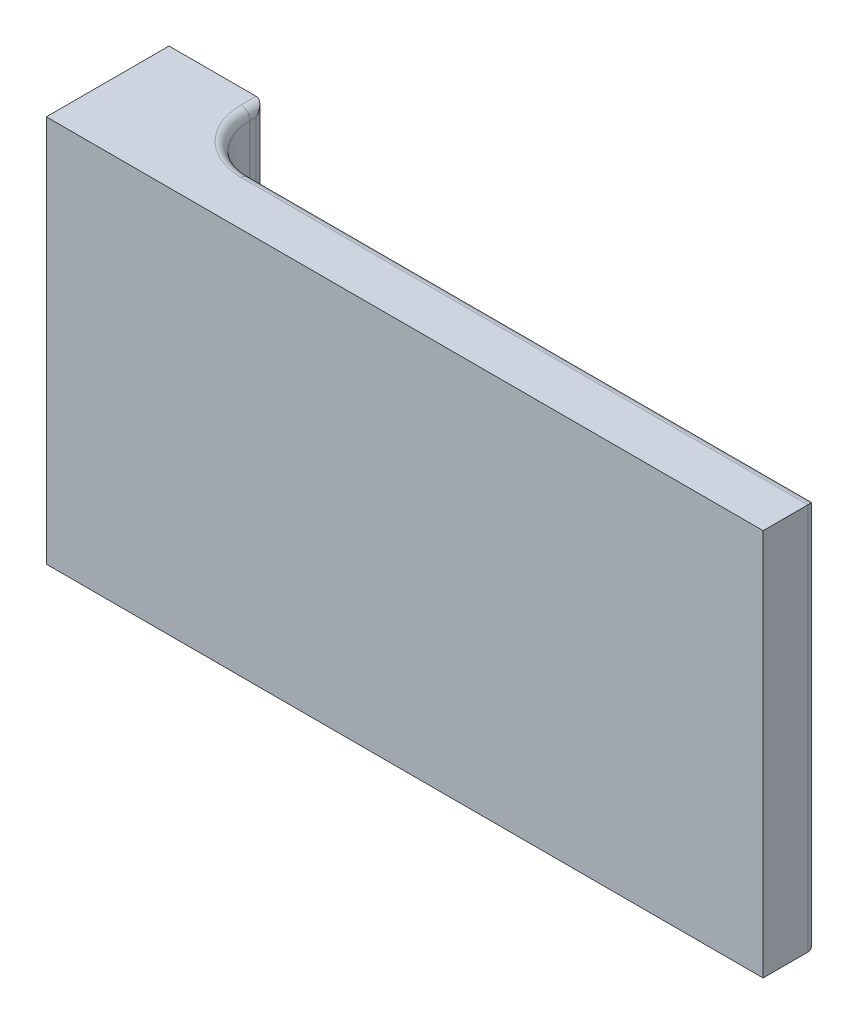
ISO-10303-21;
HEADER;
FILE_DESCRIPTION(('STEP AP214'),'2;1');
FILE_NAME('part.step','',(''),(''),'','','');
FILE_SCHEMA(('AUTOMOTIVE_DESIGN { 1 0 10303 214 1 1 1 1 }'));
ENDSEC;
DATA;
#1=APPLICATION_CONTEXT('core data for automotive mechanical design processes');
#2=APPLICATION_PROTOCOL_DEFINITION('international standard','automotive_design',2000,#1);
#3=PRODUCT_CONTEXT('',#1,'mechanical');
#4=PRODUCT('Part','Part','',(#3));
#5=PRODUCT_RELATED_PRODUCT_CATEGORY('part','',(#4));
#6=PRODUCT_DEFINITION_FORMATION('','',#4);
#7=PRODUCT_DEFINITION_CONTEXT('part definition',#1,'design');
#8=PRODUCT_DEFINITION('design','',#6,#7);
#9=PRODUCT_DEFINITION_SHAPE('','',#8);
#10=(LENGTH_UNIT() NAMED_UNIT(*) SI_UNIT(.MILLI.,.METRE.));
#11=(NAMED_UNIT(*) PLANE_ANGLE_UNIT() SI_UNIT($,.RADIAN.));
#12=(NAMED_UNIT(*) SI_UNIT($,.STERADIAN.) SOLID_ANGLE_UNIT());
#13=UNCERTAINTY_MEASURE_WITH_UNIT(LENGTH_MEASURE(1.E-05),#10,'distance_accuracy_value','');
#14=(GEOMETRIC_REPRESENTATION_CONTEXT(3) GLOBAL_UNCERTAINTY_ASSIGNED_CONTEXT((#13)) GLOBAL_UNIT_ASSIGNED_CONTEXT((#10,
#11,#12)) REPRESENTATION_CONTEXT('',''));
#15=CARTESIAN_POINT('',(0.,0.,0.));
#16=DIRECTION('',(0.,0.,1.));
#17=DIRECTION('',(1.,0.,0.));
#18=AXIS2_PLACEMENT_3D('',#15,#16,#17);
#19=CARTESIAN_POINT('',(-9.23057385456345,-8.77234834713556,-1.5));
#20=DIRECTION('',(1.,0.,0.));
#21=DIRECTION('',(0.,0.,-1.));
#22=AXIS2_PLACEMENT_3D('',#19,#20,#21);
#23=PLANE('',#22);
#24=DIRECTION('',(0.,0.,1.));
#25=VECTOR('',#24,1.);
#26=CARTESIAN_POINT('',(-9.23057385456345,-19.5725158209321,-1.5));
#27=LINE('',#26,#25);
#28=CARTESIAN_POINT('',(-9.23057385456345,-19.5725158209321,-1.25));
#29=VERTEX_POINT('',#28);
#30=CARTESIAN_POINT('',(-9.23057385456345,-19.5725158209321,0.));
#31=VERTEX_POINT('',#30);
#32=EDGE_CURVE('E176',#29,#31,#27,.T.);
#33=ORIENTED_EDGE('',*,*,#32,.F.);
#34=DIRECTION('',(0.,1.,0.));
#35=VECTOR('',#34,1.);
#36=CARTESIAN_POINT('',(-9.23057385456345,-8.77234834713556,-1.25));
#37=LINE('',#36,#35);
#38=CARTESIAN_POINT('',(-9.23057385456345,-8.77234834713556,-1.25));
#39=VERTEX_POINT('',#38);
#40=EDGE_CURVE('E48',#29,#39,#37,.T.);
#41=ORIENTED_EDGE('',*,*,#40,.T.);
#42=DIRECTION('',(0.,0.,1.));
#43=VECTOR('',#42,1.);
#44=CARTESIAN_POINT('',(-9.23057385456345,-8.77234834713556,-1.5));
#45=LINE('',#44,#43);
#46=CARTESIAN_POINT('',(-9.23057385456345,-8.77234834713556,0.));
#47=VERTEX_POINT('',#46);
#48=EDGE_CURVE('E154',#39,#47,#45,.T.);
#49=ORIENTED_EDGE('',*,*,#48,.T.);
#50=DIRECTION('',(0.,1.,0.));
#51=VECTOR('',#50,1.);
#52=CARTESIAN_POINT('',(-9.23057385456345,-8.77234834713556,0.));
#53=LINE('',#52,#51);
#54=EDGE_CURVE('E158',#31,#47,#53,.T.);
#55=ORIENTED_EDGE('',*,*,#54,.F.);
#56=EDGE_LOOP('',(#33,#41,#49,#55));
#57=FACE_BOUND('',#56,.T.);
#58=ADVANCED_FACE('F39',(#57),#23,.T.);
#59=CARTESIAN_POINT('',(-9.23057385456345,-19.5725158209321,-1.5));
#60=DIRECTION('',(0.,-1.,0.));
#61=DIRECTION('',(0.,0.,-1.));
#62=AXIS2_PLACEMENT_3D('',#59,#60,#61);
#63=PLANE('',#62);
#64=DIRECTION('',(0.,0.,1.));
#65=VECTOR('',#64,1.);
#66=CARTESIAN_POINT('',(-29.2123137237562,-19.5725158209321,-1.5));
#67=LINE('',#66,#65);
#68=CARTESIAN_POINT('',(-29.2123137237562,-19.5725158209321,-1.25));
#69=VERTEX_POINT('',#68);
#70=CARTESIAN_POINT('',(-29.2123137237562,-19.5725158209321,0.));
#71=VERTEX_POINT('',#70);
#72=EDGE_CURVE('E153',#69,#71,#67,.T.);
#73=ORIENTED_EDGE('',*,*,#72,.F.);
#74=DIRECTION('',(1.,0.,0.));
#75=VECTOR('',#74,1.);
#76=CARTESIAN_POINT('',(-9.23057385456345,-19.5725158209321,-1.25));
#77=LINE('',#76,#75);
#78=EDGE_CURVE('E207',#69,#29,#77,.T.);
#79=ORIENTED_EDGE('',*,*,#78,.T.);
#80=ORIENTED_EDGE('',*,*,#32,.T.);
#81=DIRECTION('',(1.,0.,0.));
#82=VECTOR('',#81,1.);
#83=CARTESIAN_POINT('',(-9.23057385456345,-19.5725158209321,0.));
#84=LINE('',#83,#82);
#85=EDGE_CURVE('E170',#71,#31,#84,.T.);
#86=ORIENTED_EDGE('',*,*,#85,.F.);
#87=EDGE_LOOP('',(#73,#79,#80,#86));
#88=FACE_BOUND('',#87,.T.);
#89=ADVANCED_FACE('F240',(#88),#63,.T.);
#90=CARTESIAN_POINT('',(-29.2123137237562,-8.77234834713556,-1.5));
#91=DIRECTION('',(-1.,0.,0.));
#92=DIRECTION('',(0.,0.,1.));
#93=AXIS2_PLACEMENT_3D('',#90,#91,#92);
#94=PLANE('',#93);
#95=DIRECTION('',(0.,-1.,0.));
#96=VECTOR('',#95,1.);
#97=CARTESIAN_POINT('',(-29.2123137237562,-8.77234834713556,-1.5));
#98=LINE('',#97,#96);
#99=CARTESIAN_POINT('',(-29.2123137237562,-14.8612171338496,-1.5));
#100=VERTEX_POINT('',#99);
#101=CARTESIAN_POINT('',(-29.2123137237562,-19.3225158209321,-1.5));
#102=VERTEX_POINT('',#101);
#103=EDGE_CURVE('E169',#100,#102,#98,.T.);
#104=ORIENTED_EDGE('',*,*,#103,.T.);
#105=CARTESIAN_POINT('',(-29.2123137237562,-19.3225158209321,-1.25));
#106=DIRECTION('',(-1.,0.,0.));
#107=DIRECTION('',(0.,0.,1.));
#108=AXIS2_PLACEMENT_3D('',#105,#106,#107);
#109=CIRCLE('',#108,0.25);
#110=EDGE_CURVE('E213',#102,#69,#109,.T.);
#111=ORIENTED_EDGE('',*,*,#110,.T.);
#112=ORIENTED_EDGE('',*,*,#72,.T.);
#113=DIRECTION('',(0.,-1.,0.));
#114=VECTOR('',#113,1.);
#115=CARTESIAN_POINT('',(-29.2123137237562,-8.77234834713556,0.));
#116=LINE('',#115,#114);
#117=CARTESIAN_POINT('',(-29.2123137237562,-8.77234834713556,0.));
#118=VERTEX_POINT('',#117);
#119=EDGE_CURVE('E151',#118,#71,#116,.T.);
#120=ORIENTED_EDGE('',*,*,#119,.F.);
#121=DIRECTION('',(0.,0.,1.));
#122=VECTOR('',#121,1.);
#123=CARTESIAN_POINT('',(-29.2123137237562,-8.77234834713556,-1.5));
#124=LINE('',#123,#122);
#125=CARTESIAN_POINT('',(-29.2123137237562,-8.77234834713556,-3.42000086457245));
#126=VERTEX_POINT('',#125);
#127=EDGE_CURVE('E134',#126,#118,#124,.T.);
#128=ORIENTED_EDGE('',*,*,#127,.F.);
#129=DIRECTION('',(0.,-1.,0.));
#130=VECTOR('',#129,1.);
#131=CARTESIAN_POINT('',(-29.2123137237562,-8.77234834713542,-3.42000086457245));
#132=LINE('',#131,#130);
#133=CARTESIAN_POINT('',(-29.2123137237562,-14.8612171338496,-3.42000086457233));
#134=VERTEX_POINT('',#133);
#135=EDGE_CURVE('E141',#126,#134,#132,.T.);
#136=ORIENTED_EDGE('',*,*,#135,.T.);
#137=DIRECTION('',(0.,0.,1.));
#138=VECTOR('',#137,1.);
#139=CARTESIAN_POINT('',(-29.2123137237562,-14.8612171338496,-10.2717880972808));
#140=LINE('',#139,#138);
#141=EDGE_CURVE('E166',#134,#100,#140,.T.);
#142=ORIENTED_EDGE('',*,*,#141,.T.);
#143=EDGE_LOOP('',(#104,#111,#112,#120,#128,#136,#142));
#144=FACE_BOUND('',#143,.T.);
#145=ADVANCED_FACE('F147',(#144),#94,.T.);
#146=CARTESIAN_POINT('',(-9.23057385456345,-8.77234834713556,-1.5));
#147=DIRECTION('',(0.,1.,0.));
#148=DIRECTION('',(0.,0.,1.));
#149=AXIS2_PLACEMENT_3D('',#146,#147,#148);
#150=PLANE('',#149);
#151=CARTESIAN_POINT('',(-25.0342640462904,-8.77234834713556,-3.));
#152=DIRECTION('',(0.,1.,0.));
#153=DIRECTION('',(0.,0.,1.));
#154=AXIS2_PLACEMENT_3D('',#151,#152,#153);
#155=CIRCLE('',#154,1.75);
#156=CARTESIAN_POINT('',(-25.0342640462904,-8.77234834713556,-1.25));
#157=VERTEX_POINT('',#156);
#158=CARTESIAN_POINT('',(-26.7842640462904,-8.77234834713556,-3.));
#159=VERTEX_POINT('',#158);
#160=EDGE_CURVE('E198',#157,#159,#155,.F.);
#161=ORIENTED_EDGE('',*,*,#160,.T.);
#162=DIRECTION('',(0.,0.,1.));
#163=VECTOR('',#162,1.);
#164=CARTESIAN_POINT('',(-26.7842640462904,-8.77234834713556,-3.42000089650787));
#165=LINE('',#164,#163);
#166=CARTESIAN_POINT('',(-26.7842640492717,-8.77234834713556,-3.42000089352665));
#167=VERTEX_POINT('',#166);
#168=EDGE_CURVE('E137',#159,#167,#165,.F.);
#169=ORIENTED_EDGE('',*,*,#168,.T.);
#170=DIRECTION('',(-1.,0.,1.19248806385E-08));
#171=VECTOR('',#170,1.);
#172=CARTESIAN_POINT('',(-29.2123136420495,-8.77234834713556,-3.42000086457245));
#173=LINE('',#172,#171);
#174=EDGE_CURVE('E130',#167,#126,#173,.T.);
#175=ORIENTED_EDGE('',*,*,#174,.T.);
#176=ORIENTED_EDGE('',*,*,#127,.T.);
#177=DIRECTION('',(-1.,0.,0.));
#178=VECTOR('',#177,1.);
#179=CARTESIAN_POINT('',(-9.23057385456345,-8.77234834713556,0.));
#180=LINE('',#179,#178);
#181=EDGE_CURVE('E161',#47,#118,#180,.T.);
#182=ORIENTED_EDGE('',*,*,#181,.F.);
#183=ORIENTED_EDGE('',*,*,#48,.F.);
#184=DIRECTION('',(-1.,0.,0.));
#185=VECTOR('',#184,1.);
#186=CARTESIAN_POINT('',(-9.23057385456345,-8.77234834713556,-1.25));
#187=LINE('',#186,#185);
#188=EDGE_CURVE('E196',#39,#157,#187,.T.);
#189=ORIENTED_EDGE('',*,*,#188,.T.);
#190=EDGE_LOOP('',(#161,#169,#175,#176,#182,#183,#189));
#191=FACE_BOUND('',#190,.T.);
#192=ADVANCED_FACE('F132',(#191),#150,.T.);
#193=CARTESIAN_POINT('',(0.,0.,-1.5));
#194=DIRECTION('',(0.,0.,-1.));
#195=DIRECTION('',(-1.,0.,0.));
#196=AXIS2_PLACEMENT_3D('',#193,#194,#195);
#197=PLANE('',#196);
#198=DIRECTION('',(0.,1.,0.));
#199=VECTOR('',#198,1.);
#200=CARTESIAN_POINT('',(-9.48057385456345,0.,-1.5));
#201=LINE('',#200,#199);
#202=CARTESIAN_POINT('',(-9.48057385456345,-9.02234834713556,-1.5));
#203=VERTEX_POINT('',#202);
#204=CARTESIAN_POINT('',(-9.48057385456345,-19.3225158209321,-1.5));
#205=VERTEX_POINT('',#204);
#206=EDGE_CURVE('E56',#203,#205,#201,.F.);
#207=ORIENTED_EDGE('',*,*,#206,.T.);
#208=DIRECTION('',(1.,0.,0.));
#209=VECTOR('',#208,1.);
#210=CARTESIAN_POINT('',(0.,-19.3225158209321,-1.5));
#211=LINE('',#210,#209);
#212=EDGE_CURVE('E211',#205,#102,#211,.F.);
#213=ORIENTED_EDGE('',*,*,#212,.T.);
#214=ORIENTED_EDGE('',*,*,#103,.F.);
#215=DIRECTION('',(-1.,0.,0.));
#216=VECTOR('',#215,1.);
#217=CARTESIAN_POINT('',(-29.2123137237562,-14.8612171338496,-1.5));
#218=LINE('',#217,#216);
#219=CARTESIAN_POINT('',(-25.9356518651564,-14.8612171338496,-1.5));
#220=VERTEX_POINT('',#219);
#221=EDGE_CURVE('E164',#220,#100,#218,.T.);
#222=ORIENTED_EDGE('',*,*,#221,.F.);
#223=CARTESIAN_POINT('',(-25.9356518651564,-14.8612171338496,-1.5));
#224=CARTESIAN_POINT('',(-25.9005466994518,-14.8611792441866,-1.5));
#225=CARTESIAN_POINT('',(-25.8655121637801,-14.8592608346166,-1.5));
#226=CARTESIAN_POINT('',(-25.7958349740329,-14.8523706590147,-1.5));
#227=CARTESIAN_POINT('',(-25.7611914904043,-14.8474075670327,-1.5));
#228=CARTESIAN_POINT('',(-25.6926737395816,-14.8351859924546,-1.5));
#229=CARTESIAN_POINT('',(-25.6587952897582,-14.8279497996246,-1.5));
#230=CARTESIAN_POINT('',(-25.5914593399618,-14.8116425908337,-1.5));
#231=CARTESIAN_POINT('',(-25.5580021995413,-14.8025701073846,-1.5));
#232=CARTESIAN_POINT('',(-25.4424306865108,-14.7685873722223,-1.5));
#233=CARTESIAN_POINT('',(-25.3613970993191,-14.7400678396715,-1.5));
#234=CARTESIAN_POINT('',(-25.2007128413725,-14.6791047898377,-1.5));
#235=CARTESIAN_POINT('',(-25.1210659706176,-14.6466519888259,-1.5));
#236=CARTESIAN_POINT('',(-25.0390449666571,-14.6131689326085,-1.5));
#237=CARTESIAN_POINT('',(-25.0366545096021,-14.6121930323102,-1.5));
#238=CARTESIAN_POINT('',(-25.0342640462904,-14.6112171338496,-1.5));
#239=B_SPLINE_CURVE_WITH_KNOTS('',3,(#223,#224,#225,#226,#227,#228,#229,#230,#231,#232,#233,
#234,#235,#236,#237,#238),.UNSPECIFIED.,.F.,.F.,(4,2,2,2,2,2,2,4),(0.,0.105166814941097,
0.210035400770084,0.313906171228006,0.417860281039904,0.675271269375906,0.933302113090205,
0.941048079782823),.UNSPECIFIED.);
#240=CARTESIAN_POINT('',(-25.0342640462904,-14.6112171338496,-1.5));
#241=VERTEX_POINT('',#240);
#242=EDGE_CURVE('E12',#220,#241,#239,.T.);
#243=ORIENTED_EDGE('',*,*,#242,.T.);
#244=DIRECTION('',(0.,-1.,0.));
#245=VECTOR('',#244,1.);
#246=CARTESIAN_POINT('',(-25.0342640462904,0.,-1.5));
#247=LINE('',#246,#245);
#248=CARTESIAN_POINT('',(-25.0342640462904,-9.02234834713556,-1.5));
#249=VERTEX_POINT('',#248);
#250=EDGE_CURVE('E183',#241,#249,#247,.F.);
#251=ORIENTED_EDGE('',*,*,#250,.T.);
#252=DIRECTION('',(-1.,0.,0.));
#253=VECTOR('',#252,1.);
#254=CARTESIAN_POINT('',(0.,-9.02234834713556,-1.5));
#255=LINE('',#254,#253);
#256=EDGE_CURVE('E61',#249,#203,#255,.F.);
#257=ORIENTED_EDGE('',*,*,#256,.T.);
#258=EDGE_LOOP('',(#207,#213,#214,#222,#243,#251,#257));
#259=FACE_BOUND('',#258,.T.);
#260=ADVANCED_FACE('F228',(#259),#197,.T.);
#261=CARTESIAN_POINT('',(0.,0.,0.));
#262=DIRECTION('',(0.,0.,-1.));
#263=DIRECTION('',(-1.,0.,0.));
#264=AXIS2_PLACEMENT_3D('',#261,#262,#263);
#265=PLANE('',#264);
#266=ORIENTED_EDGE('',*,*,#54,.T.);
#267=ORIENTED_EDGE('',*,*,#181,.T.);
#268=ORIENTED_EDGE('',*,*,#119,.T.);
#269=ORIENTED_EDGE('',*,*,#85,.T.);
#270=EDGE_LOOP('',(#266,#267,#268,#269));
#271=FACE_BOUND('',#270,.T.);
#272=ADVANCED_FACE('F233',(#271),#265,.F.);
#273=CARTESIAN_POINT('',(-29.2123137237562,-14.8612171338496,-10.2717880972808));
#274=DIRECTION('',(0.,1.,0.));
#275=DIRECTION('',(0.,0.,1.));
#276=AXIS2_PLACEMENT_3D('',#273,#274,#275);
#277=PLANE('',#276);
#278=DIRECTION('',(1.,0.,-1.19248806385E-08));
#279=VECTOR('',#278,1.);
#280=CARTESIAN_POINT('',(-29.2123136420495,-14.8612171338496,-3.42000086457233));
#281=LINE('',#280,#279);
#282=CARTESIAN_POINT('',(-26.7842640492717,-14.8612171338496,-3.42000089352653));
#283=VERTEX_POINT('',#282);
#284=EDGE_CURVE('E142',#134,#283,#281,.T.);
#285=ORIENTED_EDGE('',*,*,#284,.T.);
#286=DIRECTION('',(0.,0.,1.));
#287=VECTOR('',#286,1.);
#288=CARTESIAN_POINT('',(-26.7842640462904,-14.8612171338496,-10.2717880972808));
#289=LINE('',#288,#287);
#290=CARTESIAN_POINT('',(-26.7842640462904,-14.8612171338496,-3.));
#291=VERTEX_POINT('',#290);
#292=EDGE_CURVE('E187',#283,#291,#289,.T.);
#293=ORIENTED_EDGE('',*,*,#292,.T.);
#294=CARTESIAN_POINT('',(-25.0342640462904,-14.8612171338496,-3.));
#295=DIRECTION('',(0.,1.,0.));
#296=DIRECTION('',(0.,0.,1.));
#297=AXIS2_PLACEMENT_3D('',#294,#295,#296);
#298=CIRCLE('',#297,1.75);
#299=EDGE_CURVE('E185',#291,#220,#298,.T.);
#300=ORIENTED_EDGE('',*,*,#299,.T.);
#301=ORIENTED_EDGE('',*,*,#221,.T.);
#302=ORIENTED_EDGE('',*,*,#141,.F.);
#303=EDGE_LOOP('',(#285,#293,#300,#301,#302));
#304=FACE_BOUND('',#303,.T.);
#305=ADVANCED_FACE('F238',(#304),#277,.F.);
#306=CARTESIAN_POINT('',(-26.5342640462904,-8.77234834713556,-10.2717880972808));
#307=DIRECTION('',(-1.,0.,0.));
#308=DIRECTION('',(0.,0.,1.));
#309=AXIS2_PLACEMENT_3D('',#306,#307,#308);
#310=PLANE('',#309);
#311=DIRECTION('',(0.,-1.,0.));
#312=VECTOR('',#311,1.);
#313=CARTESIAN_POINT('',(-26.5342640462904,-8.77234834713556,-3.));
#314=LINE('',#313,#312);
#315=CARTESIAN_POINT('',(-26.5342640462904,-9.02234834713556,-3.));
#316=VERTEX_POINT('',#315);
#317=CARTESIAN_POINT('',(-26.5342640462904,-14.6112171338496,-3.));
#318=VERTEX_POINT('',#317);
#319=EDGE_CURVE('E178',#316,#318,#314,.T.);
#320=ORIENTED_EDGE('',*,*,#319,.T.);
#321=DIRECTION('',(0.,0.,1.));
#322=VECTOR('',#321,1.);
#323=CARTESIAN_POINT('',(-26.5342640462904,-14.6112171338496,-10.2717880972808));
#324=LINE('',#323,#322);
#325=CARTESIAN_POINT('',(-26.5342640462904,-14.6112171338496,-3.17000089352654));
#326=VERTEX_POINT('',#325);
#327=EDGE_CURVE('E194',#318,#326,#324,.F.);
#328=ORIENTED_EDGE('',*,*,#327,.T.);
#329=DIRECTION('',(0.,1.,0.));
#330=VECTOR('',#329,1.);
#331=CARTESIAN_POINT('',(-26.5342640462904,-8.77234834713541,-3.17000089352665));
#332=LINE('',#331,#330);
#333=CARTESIAN_POINT('',(-26.5342640462904,-9.02234834713556,-3.17000089352665));
#334=VERTEX_POINT('',#333);
#335=EDGE_CURVE('E190',#326,#334,#332,.T.);
#336=ORIENTED_EDGE('',*,*,#335,.T.);
#337=DIRECTION('',(0.,0.,1.));
#338=VECTOR('',#337,1.);
#339=CARTESIAN_POINT('',(-26.5342640462904,-9.02234834713556,-3.));
#340=LINE('',#339,#338);
#341=EDGE_CURVE('E192',#334,#316,#340,.T.);
#342=ORIENTED_EDGE('',*,*,#341,.T.);
#343=EDGE_LOOP('',(#320,#328,#336,#342));
#344=FACE_BOUND('',#343,.T.);
#345=ADVANCED_FACE('F234',(#344),#310,.F.);
#346=CARTESIAN_POINT('',(-22.6723133122811,-12.7159914837412,-3.4200009425611));
#347=DIRECTION('',(1.19248806385E-08,0.,1.));
#348=DIRECTION('',(0.,-1.,0.));
#349=AXIS2_PLACEMENT_3D('',#346,#347,#348);
#350=PLANE('',#349);
#351=ORIENTED_EDGE('',*,*,#174,.F.);
#352=DIRECTION('',(0.,1.,0.));
#353=VECTOR('',#352,1.);
#354=CARTESIAN_POINT('',(-26.7842640492717,-12.7159914837412,-3.42000089352657));
#355=LINE('',#354,#353);
#356=EDGE_CURVE('E205',#167,#283,#355,.F.);
#357=ORIENTED_EDGE('',*,*,#356,.T.);
#358=ORIENTED_EDGE('',*,*,#284,.F.);
#359=ORIENTED_EDGE('',*,*,#135,.F.);
#360=EDGE_LOOP('',(#351,#357,#358,#359));
#361=FACE_BOUND('',#360,.T.);
#362=ADVANCED_FACE('F156',(#361),#350,.F.);
#363=CARTESIAN_POINT('',(-25.0342640462904,-8.77234834713556,-3.));
#364=DIRECTION('',(0.,-1.,0.));
#365=DIRECTION('',(0.,0.,-1.));
#366=AXIS2_PLACEMENT_3D('',#363,#364,#365);
#367=CYLINDRICAL_SURFACE('',#366,1.5);
#368=ORIENTED_EDGE('',*,*,#319,.F.);
#369=CARTESIAN_POINT('',(-25.0342640462904,-9.02234834713556,-3.));
#370=DIRECTION('',(0.,1.,0.));
#371=DIRECTION('',(0.,0.,1.));
#372=AXIS2_PLACEMENT_3D('',#369,#370,#371);
#373=CIRCLE('',#372,1.5);
#374=EDGE_CURVE('E203',#316,#249,#373,.T.);
#375=ORIENTED_EDGE('',*,*,#374,.T.);
#376=ORIENTED_EDGE('',*,*,#250,.F.);
#377=CARTESIAN_POINT('',(-25.0342640462904,-14.6112171338496,-3.));
#378=DIRECTION('',(0.,1.,0.));
#379=DIRECTION('',(0.,0.,1.));
#380=AXIS2_PLACEMENT_3D('',#377,#378,#379);
#381=CIRCLE('',#380,1.5);
#382=EDGE_CURVE('E201',#241,#318,#381,.F.);
#383=ORIENTED_EDGE('',*,*,#382,.T.);
#384=EDGE_LOOP('',(#368,#375,#376,#383));
#385=FACE_BOUND('',#384,.T.);
#386=ADVANCED_FACE('F251',(#385),#367,.F.);
#387=CARTESIAN_POINT('',(-9.23057385456345,-19.3225158209321,-1.25));
#388=DIRECTION('',(1.,0.,0.));
#389=DIRECTION('',(0.,0.,-1.));
#390=AXIS2_PLACEMENT_3D('',#387,#388,#389);
#391=CYLINDRICAL_SURFACE('',#390,0.25);
#392=ORIENTED_EDGE('',*,*,#110,.F.);
#393=ORIENTED_EDGE('',*,*,#212,.F.);
#394=CARTESIAN_POINT('',(-9.48057385456345,-19.3225158209321,-1.25));
#395=DIRECTION('',(0.707106781186547,0.707106781186547,0.));
#396=DIRECTION('',(-0.707106781186547,0.707106781186547,0.));
#397=AXIS2_PLACEMENT_3D('',#394,#395,#396);
#398=ELLIPSE('',#397,0.353553390593274,0.25);
#399=EDGE_CURVE('E43',#29,#205,#398,.T.);
#400=ORIENTED_EDGE('',*,*,#399,.F.);
#401=ORIENTED_EDGE('',*,*,#78,.F.);
#402=EDGE_LOOP('',(#392,#393,#400,#401));
#403=FACE_BOUND('',#402,.T.);
#404=ADVANCED_FACE('F41',(#403),#391,.T.);
#405=CARTESIAN_POINT('',(-9.48057385456345,-8.77234834713556,-1.25));
#406=DIRECTION('',(0.,1.,0.));
#407=DIRECTION('',(0.,0.,1.));
#408=AXIS2_PLACEMENT_3D('',#405,#406,#407);
#409=CYLINDRICAL_SURFACE('',#408,0.25);
#410=ORIENTED_EDGE('',*,*,#399,.T.);
#411=ORIENTED_EDGE('',*,*,#206,.F.);
#412=CARTESIAN_POINT('',(-9.48057385456345,-9.02234834713556,-1.25));
#413=DIRECTION('',(-0.707106781186547,0.707106781186547,0.));
#414=DIRECTION('',(-0.707106781186547,-0.707106781186547,0.));
#415=AXIS2_PLACEMENT_3D('',#412,#413,#414);
#416=ELLIPSE('',#415,0.353553390593274,0.25);
#417=EDGE_CURVE('E280',#39,#203,#416,.T.);
#418=ORIENTED_EDGE('',*,*,#417,.F.);
#419=ORIENTED_EDGE('',*,*,#40,.F.);
#420=EDGE_LOOP('',(#410,#411,#418,#419));
#421=FACE_BOUND('',#420,.T.);
#422=ADVANCED_FACE('F289',(#421),#409,.T.);
#423=CARTESIAN_POINT('',(-9.23057385456345,-9.02234834713556,-1.25));
#424=DIRECTION('',(-1.,0.,0.));
#425=DIRECTION('',(0.,0.,1.));
#426=AXIS2_PLACEMENT_3D('',#423,#424,#425);
#427=CYLINDRICAL_SURFACE('',#426,0.25);
#428=ORIENTED_EDGE('',*,*,#417,.T.);
#429=ORIENTED_EDGE('',*,*,#256,.F.);
#430=CARTESIAN_POINT('',(-25.0342640462904,-9.02234834713556,-1.25));
#431=DIRECTION('',(-1.,0.,0.));
#432=DIRECTION('',(0.,0.,1.));
#433=AXIS2_PLACEMENT_3D('',#430,#431,#432);
#434=CIRCLE('',#433,0.25);
#435=EDGE_CURVE('E278',#157,#249,#434,.T.);
#436=ORIENTED_EDGE('',*,*,#435,.F.);
#437=ORIENTED_EDGE('',*,*,#188,.F.);
#438=EDGE_LOOP('',(#428,#429,#436,#437));
#439=FACE_BOUND('',#438,.T.);
#440=ADVANCED_FACE('F317',(#439),#427,.T.);
#441=CARTESIAN_POINT('',(-25.0342640462904,-9.02234834713556,-3.));
#442=DIRECTION('',(0.,1.,0.));
#443=DIRECTION('',(0.,0.,1.));
#444=AXIS2_PLACEMENT_3D('',#441,#442,#443);
#445=TOROIDAL_SURFACE('',#444,1.75,0.25);
#446=ORIENTED_EDGE('',*,*,#435,.T.);
#447=ORIENTED_EDGE('',*,*,#374,.F.);
#448=CARTESIAN_POINT('',(-26.7842640462904,-9.02234834713556,-3.));
#449=DIRECTION('',(0.,0.,-1.));
#450=DIRECTION('',(-1.,0.,0.));
#451=AXIS2_PLACEMENT_3D('',#448,#449,#450);
#452=CIRCLE('',#451,0.25);
#453=EDGE_CURVE('E273',#159,#316,#452,.T.);
#454=ORIENTED_EDGE('',*,*,#453,.F.);
#455=ORIENTED_EDGE('',*,*,#160,.F.);
#456=EDGE_LOOP('',(#446,#447,#454,#455));
#457=FACE_BOUND('',#456,.T.);
#458=ADVANCED_FACE('F312',(#457),#445,.T.);
#459=CARTESIAN_POINT('',(-26.7842640462904,-9.02234834713556,-10.2717880972808));
#460=DIRECTION('',(0.,0.,-1.));
#461=DIRECTION('',(-1.,0.,0.));
#462=AXIS2_PLACEMENT_3D('',#459,#460,#461);
#463=CYLINDRICAL_SURFACE('',#462,0.25);
#464=ORIENTED_EDGE('',*,*,#453,.T.);
#465=ORIENTED_EDGE('',*,*,#341,.F.);
#466=CARTESIAN_POINT('',(-26.7842640462904,-9.02234834713556,-3.17000089352665));
#467=DIRECTION('',(0.,0.707106781186554,0.70710678118654));
#468=DIRECTION('',(0.,0.707106781186541,-0.707106781186555));
#469=AXIS2_PLACEMENT_3D('',#466,#467,#468);
#470=ELLIPSE('',#469,0.353553390593277,0.25);
#471=EDGE_CURVE('E271',#167,#334,#470,.F.);
#472=ORIENTED_EDGE('',*,*,#471,.F.);
#473=ORIENTED_EDGE('',*,*,#168,.F.);
#474=EDGE_LOOP('',(#464,#465,#472,#473));
#475=FACE_BOUND('',#474,.T.);
#476=ADVANCED_FACE('F306',(#475),#463,.T.);
#477=CARTESIAN_POINT('',(-26.7842640462904,-8.77234834713541,-3.17000089352665));
#478=DIRECTION('',(0.,1.,0.));
#479=DIRECTION('',(0.,0.,1.));
#480=AXIS2_PLACEMENT_3D('',#477,#478,#479);
#481=CYLINDRICAL_SURFACE('',#480,0.25);
#482=ORIENTED_EDGE('',*,*,#471,.T.);
#483=ORIENTED_EDGE('',*,*,#335,.F.);
#484=CARTESIAN_POINT('',(-26.7842640462904,-14.6112171338496,-3.17000089352654));
#485=DIRECTION('',(0.,0.707106781186541,-0.707106781186555));
#486=DIRECTION('',(0.,0.707106781186554,0.70710678118654));
#487=AXIS2_PLACEMENT_3D('',#484,#485,#486);
#488=ELLIPSE('',#487,0.35355339059327,0.25);
#489=EDGE_CURVE('E266',#283,#326,#488,.F.);
#490=ORIENTED_EDGE('',*,*,#489,.F.);
#491=ORIENTED_EDGE('',*,*,#356,.F.);
#492=EDGE_LOOP('',(#482,#483,#490,#491));
#493=FACE_BOUND('',#492,.T.);
#494=ADVANCED_FACE('F260',(#493),#481,.T.);
#495=CARTESIAN_POINT('',(-25.0342640462904,-14.6112171338496,-3.));
#496=DIRECTION('',(0.,1.,0.));
#497=DIRECTION('',(0.,0.,1.));
#498=AXIS2_PLACEMENT_3D('',#495,#496,#497);
#499=TOROIDAL_SURFACE('',#498,1.75,0.25);
#500=ORIENTED_EDGE('',*,*,#242,.F.);
#501=ORIENTED_EDGE('',*,*,#299,.F.);
#502=CARTESIAN_POINT('',(-26.7842640462904,-14.6112171338496,-3.));
#503=DIRECTION('',(0.,0.,-1.));
#504=DIRECTION('',(-1.,0.,0.));
#505=AXIS2_PLACEMENT_3D('',#502,#503,#504);
#506=CIRCLE('',#505,0.25);
#507=EDGE_CURVE('E222',#318,#291,#506,.T.);
#508=ORIENTED_EDGE('',*,*,#507,.F.);
#509=ORIENTED_EDGE('',*,*,#382,.F.);
#510=EDGE_LOOP('',(#500,#501,#508,#509));
#511=FACE_BOUND('',#510,.T.);
#512=ADVANCED_FACE('F224',(#511),#499,.T.);
#513=CARTESIAN_POINT('',(-26.7842640462904,-14.6112171338496,-10.2717880972808));
#514=DIRECTION('',(0.,0.,1.));
#515=DIRECTION('',(1.,0.,0.));
#516=AXIS2_PLACEMENT_3D('',#513,#514,#515);
#517=CYLINDRICAL_SURFACE('',#516,0.25);
#518=ORIENTED_EDGE('',*,*,#489,.T.);
#519=ORIENTED_EDGE('',*,*,#327,.F.);
#520=ORIENTED_EDGE('',*,*,#507,.T.);
#521=ORIENTED_EDGE('',*,*,#292,.F.);
#522=EDGE_LOOP('',(#518,#519,#520,#521));
#523=FACE_BOUND('',#522,.T.);
#524=ADVANCED_FACE('F254',(#523),#517,.T.);
#525=CLOSED_SHELL('',(#58,#89,#145,#192,#260,#272,#305,#345,#362,#386,#404,#422,#440,#458,#476,
#494,#512,#524));
#526=MANIFOLD_SOLID_BREP('B2',#525);
#527=ADVANCED_BREP_SHAPE_REPRESENTATION('',(#18,#526),#14);
#528=SHAPE_DEFINITION_REPRESENTATION(#9,#527);
ENDSEC;
END-ISO-10303-21;
